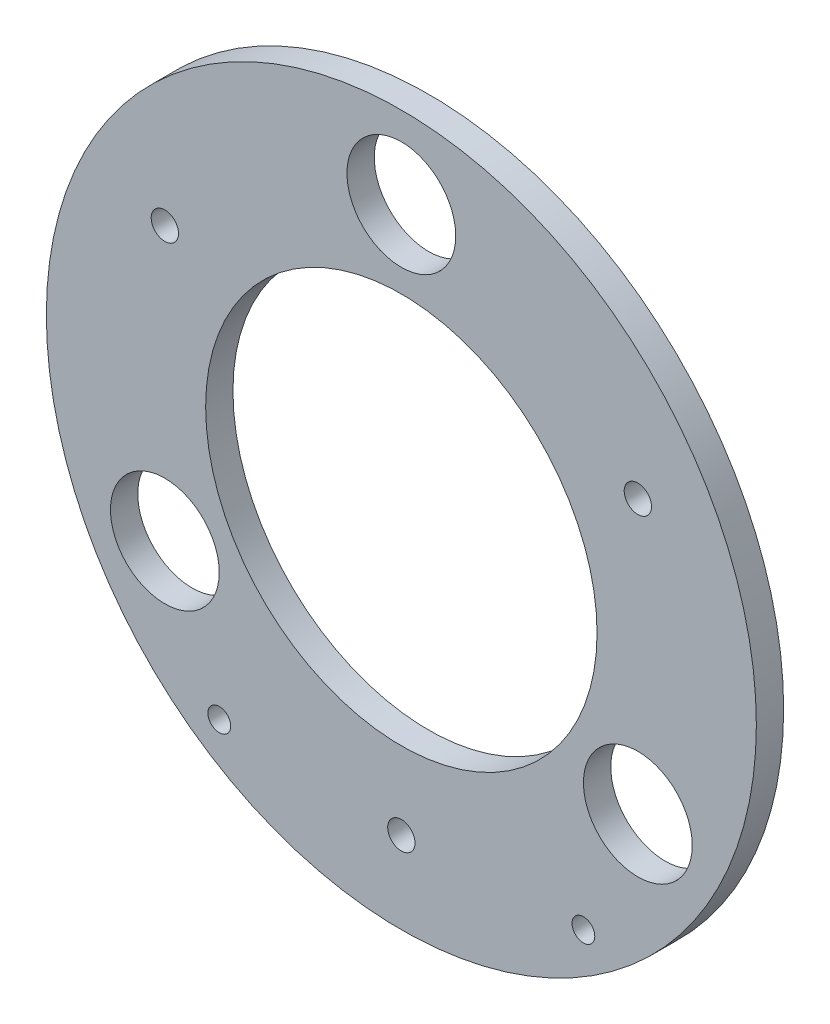
ISO-10303-21;
HEADER;
FILE_DESCRIPTION(('STEP AP214'),'2;1');
FILE_NAME('part.step','',(''),(''),'','','');
FILE_SCHEMA(('AUTOMOTIVE_DESIGN { 1 0 10303 214 1 1 1 1 }'));
ENDSEC;
DATA;
#1=APPLICATION_CONTEXT('core data for automotive mechanical design processes');
#2=APPLICATION_PROTOCOL_DEFINITION('international standard','automotive_design',2000,#1);
#3=PRODUCT_CONTEXT('',#1,'mechanical');
#4=PRODUCT('Part','Part','',(#3));
#5=PRODUCT_RELATED_PRODUCT_CATEGORY('part','',(#4));
#6=PRODUCT_DEFINITION_FORMATION('','',#4);
#7=PRODUCT_DEFINITION_CONTEXT('part definition',#1,'design');
#8=PRODUCT_DEFINITION('design','',#6,#7);
#9=PRODUCT_DEFINITION_SHAPE('','',#8);
#10=(LENGTH_UNIT() NAMED_UNIT(*) SI_UNIT(.MILLI.,.METRE.));
#11=(NAMED_UNIT(*) PLANE_ANGLE_UNIT() SI_UNIT($,.RADIAN.));
#12=(NAMED_UNIT(*) SI_UNIT($,.STERADIAN.) SOLID_ANGLE_UNIT());
#13=UNCERTAINTY_MEASURE_WITH_UNIT(LENGTH_MEASURE(1.E-05),#10,'distance_accuracy_value','');
#14=(GEOMETRIC_REPRESENTATION_CONTEXT(3) GLOBAL_UNCERTAINTY_ASSIGNED_CONTEXT((#13)) GLOBAL_UNIT_ASSIGNED_CONTEXT((#10,
#11,#12)) REPRESENTATION_CONTEXT('',''));
#15=CARTESIAN_POINT('',(0.,0.,0.));
#16=DIRECTION('',(0.,0.,1.));
#17=DIRECTION('',(1.,0.,0.));
#18=AXIS2_PLACEMENT_3D('',#15,#16,#17);
#19=CARTESIAN_POINT('',(0.,0.,3.));
#20=DIRECTION('',(0.,0.,1.));
#21=DIRECTION('',(1.,0.,0.));
#22=AXIS2_PLACEMENT_3D('',#19,#20,#21);
#23=PLANE('',#22);
#24=CARTESIAN_POINT('',(0.,0.,3.));
#25=DIRECTION('',(0.,0.,-1.));
#26=DIRECTION('',(-1.,0.,0.));
#27=AXIS2_PLACEMENT_3D('',#24,#25,#26);
#28=CIRCLE('',#27,21.5);
#29=CARTESIAN_POINT('',(-21.5,0.,3.));
#30=VERTEX_POINT('',#29);
#31=EDGE_CURVE('E73',#30,#30,#28,.T.);
#32=ORIENTED_EDGE('',*,*,#31,.T.);
#33=EDGE_LOOP('',(#32));
#34=FACE_BOUND('',#33,.T.);
#35=CARTESIAN_POINT('',(-20.,-29.,3.));
#36=DIRECTION('',(0.,0.,1.));
#37=DIRECTION('',(1.,0.,0.));
#38=AXIS2_PLACEMENT_3D('',#35,#36,#37);
#39=CIRCLE('',#38,1.25);
#40=CARTESIAN_POINT('',(-18.75,-29.,3.));
#41=VERTEX_POINT('',#40);
#42=EDGE_CURVE('E61',#41,#41,#39,.T.);
#43=ORIENTED_EDGE('',*,*,#42,.F.);
#44=EDGE_LOOP('',(#43));
#45=FACE_BOUND('',#44,.T.);
#46=CARTESIAN_POINT('',(-25.9807621135332,15.,3.));
#47=DIRECTION('',(0.,0.,1.));
#48=DIRECTION('',(1.,0.,0.));
#49=AXIS2_PLACEMENT_3D('',#46,#47,#48);
#50=CIRCLE('',#49,1.5);
#51=CARTESIAN_POINT('',(-24.4807621135332,15.,3.));
#52=VERTEX_POINT('',#51);
#53=EDGE_CURVE('E49',#52,#52,#50,.T.);
#54=ORIENTED_EDGE('',*,*,#53,.F.);
#55=EDGE_LOOP('',(#54));
#56=FACE_BOUND('',#55,.T.);
#57=CARTESIAN_POINT('',(0.,30.,3.));
#58=DIRECTION('',(0.,0.,1.));
#59=DIRECTION('',(1.,0.,0.));
#60=AXIS2_PLACEMENT_3D('',#57,#58,#59);
#61=CIRCLE('',#60,5.975);
#62=CARTESIAN_POINT('',(5.975,30.,3.));
#63=VERTEX_POINT('',#62);
#64=EDGE_CURVE('E37',#63,#63,#61,.T.);
#65=ORIENTED_EDGE('',*,*,#64,.F.);
#66=EDGE_LOOP('',(#65));
#67=FACE_BOUND('',#66,.T.);
#68=CARTESIAN_POINT('',(-25.9807621135332,-15.,3.));
#69=DIRECTION('',(0.,0.,1.));
#70=DIRECTION('',(1.,0.,0.));
#71=AXIS2_PLACEMENT_3D('',#68,#69,#70);
#72=CIRCLE('',#71,5.975);
#73=CARTESIAN_POINT('',(-20.0057621135332,-15.,3.));
#74=VERTEX_POINT('',#73);
#75=EDGE_CURVE('E26',#74,#74,#72,.T.);
#76=ORIENTED_EDGE('',*,*,#75,.F.);
#77=EDGE_LOOP('',(#76));
#78=FACE_BOUND('',#77,.T.);
#79=CARTESIAN_POINT('',(0.,0.,3.));
#80=DIRECTION('',(0.,0.,1.));
#81=DIRECTION('',(1.,0.,0.));
#82=AXIS2_PLACEMENT_3D('',#79,#80,#81);
#83=CIRCLE('',#82,39.);
#84=CARTESIAN_POINT('',(39.,0.,3.));
#85=VERTEX_POINT('',#84);
#86=EDGE_CURVE('E10',#85,#85,#83,.T.);
#87=ORIENTED_EDGE('',*,*,#86,.T.);
#88=EDGE_LOOP('',(#87));
#89=FACE_BOUND('',#88,.T.);
#90=CARTESIAN_POINT('',(25.9807621135332,-15.,3.));
#91=DIRECTION('',(0.,0.,1.));
#92=DIRECTION('',(1.,0.,0.));
#93=AXIS2_PLACEMENT_3D('',#90,#91,#92);
#94=CIRCLE('',#93,5.975);
#95=CARTESIAN_POINT('',(31.9557621135332,-15.,3.));
#96=VERTEX_POINT('',#95);
#97=EDGE_CURVE('E31',#96,#96,#94,.T.);
#98=ORIENTED_EDGE('',*,*,#97,.F.);
#99=EDGE_LOOP('',(#98));
#100=FACE_BOUND('',#99,.T.);
#101=CARTESIAN_POINT('',(25.9807621135332,15.,3.));
#102=DIRECTION('',(0.,0.,1.));
#103=DIRECTION('',(1.,0.,0.));
#104=AXIS2_PLACEMENT_3D('',#101,#102,#103);
#105=CIRCLE('',#104,1.5);
#106=CARTESIAN_POINT('',(27.4807621135332,15.,3.));
#107=VERTEX_POINT('',#106);
#108=EDGE_CURVE('E43',#107,#107,#105,.T.);
#109=ORIENTED_EDGE('',*,*,#108,.F.);
#110=EDGE_LOOP('',(#109));
#111=FACE_BOUND('',#110,.T.);
#112=CARTESIAN_POINT('',(0.,-30.,3.));
#113=DIRECTION('',(0.,0.,1.));
#114=DIRECTION('',(1.,0.,0.));
#115=AXIS2_PLACEMENT_3D('',#112,#113,#114);
#116=CIRCLE('',#115,1.5);
#117=CARTESIAN_POINT('',(1.5,-30.,3.));
#118=VERTEX_POINT('',#117);
#119=EDGE_CURVE('E55',#118,#118,#116,.T.);
#120=ORIENTED_EDGE('',*,*,#119,.F.);
#121=EDGE_LOOP('',(#120));
#122=FACE_BOUND('',#121,.T.);
#123=CARTESIAN_POINT('',(20.,-29.,3.));
#124=DIRECTION('',(0.,0.,1.));
#125=DIRECTION('',(1.,0.,0.));
#126=AXIS2_PLACEMENT_3D('',#123,#124,#125);
#127=CIRCLE('',#126,1.25);
#128=CARTESIAN_POINT('',(21.25,-29.,3.));
#129=VERTEX_POINT('',#128);
#130=EDGE_CURVE('E67',#129,#129,#127,.T.);
#131=ORIENTED_EDGE('',*,*,#130,.F.);
#132=EDGE_LOOP('',(#131));
#133=FACE_BOUND('',#132,.T.);
#134=ADVANCED_FACE('F15',(#34,#45,#56,#67,#78,#89,#100,#111,#122,#133),#23,.T.);
#135=CARTESIAN_POINT('',(0.,0.,0.));
#136=DIRECTION('',(0.,0.,1.));
#137=DIRECTION('',(1.,0.,0.));
#138=AXIS2_PLACEMENT_3D('',#135,#136,#137);
#139=PLANE('',#138);
#140=CARTESIAN_POINT('',(0.,0.,0.));
#141=DIRECTION('',(0.,0.,-1.));
#142=DIRECTION('',(-1.,0.,0.));
#143=AXIS2_PLACEMENT_3D('',#140,#141,#142);
#144=CIRCLE('',#143,21.5);
#145=CARTESIAN_POINT('',(-21.5,0.,0.));
#146=VERTEX_POINT('',#145);
#147=EDGE_CURVE('E76',#146,#146,#144,.T.);
#148=ORIENTED_EDGE('',*,*,#147,.F.);
#149=EDGE_LOOP('',(#148));
#150=FACE_BOUND('',#149,.T.);
#151=CARTESIAN_POINT('',(0.,0.,0.));
#152=DIRECTION('',(0.,0.,1.));
#153=DIRECTION('',(1.,0.,0.));
#154=AXIS2_PLACEMENT_3D('',#151,#152,#153);
#155=CIRCLE('',#154,39.);
#156=CARTESIAN_POINT('',(39.,0.,0.));
#157=VERTEX_POINT('',#156);
#158=EDGE_CURVE('E19',#157,#157,#155,.T.);
#159=ORIENTED_EDGE('',*,*,#158,.F.);
#160=EDGE_LOOP('',(#159));
#161=FACE_BOUND('',#160,.T.);
#162=CARTESIAN_POINT('',(-25.9807621135332,-15.,0.));
#163=DIRECTION('',(0.,0.,1.));
#164=DIRECTION('',(1.,0.,0.));
#165=AXIS2_PLACEMENT_3D('',#162,#163,#164);
#166=CIRCLE('',#165,5.975);
#167=CARTESIAN_POINT('',(-20.0057621135332,-15.,0.));
#168=VERTEX_POINT('',#167);
#169=EDGE_CURVE('E28',#168,#168,#166,.T.);
#170=ORIENTED_EDGE('',*,*,#169,.T.);
#171=EDGE_LOOP('',(#170));
#172=FACE_BOUND('',#171,.T.);
#173=CARTESIAN_POINT('',(25.9807621135332,-15.,0.));
#174=DIRECTION('',(0.,0.,1.));
#175=DIRECTION('',(1.,0.,0.));
#176=AXIS2_PLACEMENT_3D('',#173,#174,#175);
#177=CIRCLE('',#176,5.975);
#178=CARTESIAN_POINT('',(31.9557621135332,-15.,0.));
#179=VERTEX_POINT('',#178);
#180=EDGE_CURVE('E34',#179,#179,#177,.T.);
#181=ORIENTED_EDGE('',*,*,#180,.T.);
#182=EDGE_LOOP('',(#181));
#183=FACE_BOUND('',#182,.T.);
#184=CARTESIAN_POINT('',(0.,30.,0.));
#185=DIRECTION('',(0.,0.,1.));
#186=DIRECTION('',(1.,0.,0.));
#187=AXIS2_PLACEMENT_3D('',#184,#185,#186);
#188=CIRCLE('',#187,5.975);
#189=CARTESIAN_POINT('',(5.975,30.,0.));
#190=VERTEX_POINT('',#189);
#191=EDGE_CURVE('E40',#190,#190,#188,.T.);
#192=ORIENTED_EDGE('',*,*,#191,.T.);
#193=EDGE_LOOP('',(#192));
#194=FACE_BOUND('',#193,.T.);
#195=CARTESIAN_POINT('',(25.9807621135332,15.,0.));
#196=DIRECTION('',(0.,0.,1.));
#197=DIRECTION('',(1.,0.,0.));
#198=AXIS2_PLACEMENT_3D('',#195,#196,#197);
#199=CIRCLE('',#198,1.5);
#200=CARTESIAN_POINT('',(27.4807621135332,15.,0.));
#201=VERTEX_POINT('',#200);
#202=EDGE_CURVE('E46',#201,#201,#199,.T.);
#203=ORIENTED_EDGE('',*,*,#202,.T.);
#204=EDGE_LOOP('',(#203));
#205=FACE_BOUND('',#204,.T.);
#206=CARTESIAN_POINT('',(-25.9807621135332,15.,0.));
#207=DIRECTION('',(0.,0.,1.));
#208=DIRECTION('',(1.,0.,0.));
#209=AXIS2_PLACEMENT_3D('',#206,#207,#208);
#210=CIRCLE('',#209,1.5);
#211=CARTESIAN_POINT('',(-24.4807621135332,15.,0.));
#212=VERTEX_POINT('',#211);
#213=EDGE_CURVE('E52',#212,#212,#210,.T.);
#214=ORIENTED_EDGE('',*,*,#213,.T.);
#215=EDGE_LOOP('',(#214));
#216=FACE_BOUND('',#215,.T.);
#217=CARTESIAN_POINT('',(0.,-30.,0.));
#218=DIRECTION('',(0.,0.,1.));
#219=DIRECTION('',(1.,0.,0.));
#220=AXIS2_PLACEMENT_3D('',#217,#218,#219);
#221=CIRCLE('',#220,1.5);
#222=CARTESIAN_POINT('',(1.5,-30.,0.));
#223=VERTEX_POINT('',#222);
#224=EDGE_CURVE('E58',#223,#223,#221,.T.);
#225=ORIENTED_EDGE('',*,*,#224,.T.);
#226=EDGE_LOOP('',(#225));
#227=FACE_BOUND('',#226,.T.);
#228=CARTESIAN_POINT('',(-20.,-29.,0.));
#229=DIRECTION('',(0.,0.,1.));
#230=DIRECTION('',(1.,0.,0.));
#231=AXIS2_PLACEMENT_3D('',#228,#229,#230);
#232=CIRCLE('',#231,1.25);
#233=CARTESIAN_POINT('',(-18.75,-29.,0.));
#234=VERTEX_POINT('',#233);
#235=EDGE_CURVE('E64',#234,#234,#232,.T.);
#236=ORIENTED_EDGE('',*,*,#235,.T.);
#237=EDGE_LOOP('',(#236));
#238=FACE_BOUND('',#237,.T.);
#239=CARTESIAN_POINT('',(20.,-29.,0.));
#240=DIRECTION('',(0.,0.,1.));
#241=DIRECTION('',(1.,0.,0.));
#242=AXIS2_PLACEMENT_3D('',#239,#240,#241);
#243=CIRCLE('',#242,1.25);
#244=CARTESIAN_POINT('',(21.25,-29.,0.));
#245=VERTEX_POINT('',#244);
#246=EDGE_CURVE('E70',#245,#245,#243,.T.);
#247=ORIENTED_EDGE('',*,*,#246,.T.);
#248=EDGE_LOOP('',(#247));
#249=FACE_BOUND('',#248,.T.);
#250=ADVANCED_FACE('F91',(#150,#161,#172,#183,#194,#205,#216,#227,#238,#249),#139,.F.);
#251=CARTESIAN_POINT('',(0.,0.,3.));
#252=DIRECTION('',(0.,0.,-1.));
#253=DIRECTION('',(-1.,0.,0.));
#254=AXIS2_PLACEMENT_3D('',#251,#252,#253);
#255=CYLINDRICAL_SURFACE('',#254,39.);
#256=ORIENTED_EDGE('',*,*,#86,.F.);
#257=EDGE_LOOP('',(#256));
#258=FACE_BOUND('',#257,.T.);
#259=ORIENTED_EDGE('',*,*,#158,.T.);
#260=EDGE_LOOP('',(#259));
#261=FACE_BOUND('',#260,.T.);
#262=ADVANCED_FACE('F17',(#258,#261),#255,.T.);
#263=CARTESIAN_POINT('',(-25.9807621135332,-15.,3.));
#264=DIRECTION('',(0.,0.,-1.));
#265=DIRECTION('',(-1.,0.,0.));
#266=AXIS2_PLACEMENT_3D('',#263,#264,#265);
#267=CYLINDRICAL_SURFACE('',#266,5.975);
#268=ORIENTED_EDGE('',*,*,#75,.T.);
#269=EDGE_LOOP('',(#268));
#270=FACE_BOUND('',#269,.T.);
#271=ORIENTED_EDGE('',*,*,#169,.F.);
#272=EDGE_LOOP('',(#271));
#273=FACE_BOUND('',#272,.T.);
#274=ADVANCED_FACE('F130',(#270,#273),#267,.F.);
#275=CARTESIAN_POINT('',(25.9807621135332,-15.,3.));
#276=DIRECTION('',(0.,0.,-1.));
#277=DIRECTION('',(-1.,0.,0.));
#278=AXIS2_PLACEMENT_3D('',#275,#276,#277);
#279=CYLINDRICAL_SURFACE('',#278,5.975);
#280=ORIENTED_EDGE('',*,*,#97,.T.);
#281=EDGE_LOOP('',(#280));
#282=FACE_BOUND('',#281,.T.);
#283=ORIENTED_EDGE('',*,*,#180,.F.);
#284=EDGE_LOOP('',(#283));
#285=FACE_BOUND('',#284,.T.);
#286=ADVANCED_FACE('F133',(#282,#285),#279,.F.);
#287=CARTESIAN_POINT('',(0.,30.,3.));
#288=DIRECTION('',(0.,0.,-1.));
#289=DIRECTION('',(-1.,0.,0.));
#290=AXIS2_PLACEMENT_3D('',#287,#288,#289);
#291=CYLINDRICAL_SURFACE('',#290,5.975);
#292=ORIENTED_EDGE('',*,*,#64,.T.);
#293=EDGE_LOOP('',(#292));
#294=FACE_BOUND('',#293,.T.);
#295=ORIENTED_EDGE('',*,*,#191,.F.);
#296=EDGE_LOOP('',(#295));
#297=FACE_BOUND('',#296,.T.);
#298=ADVANCED_FACE('F137',(#294,#297),#291,.F.);
#299=CARTESIAN_POINT('',(25.9807621135332,15.,3.));
#300=DIRECTION('',(0.,0.,-1.));
#301=DIRECTION('',(-1.,0.,0.));
#302=AXIS2_PLACEMENT_3D('',#299,#300,#301);
#303=CYLINDRICAL_SURFACE('',#302,1.5);
#304=ORIENTED_EDGE('',*,*,#108,.T.);
#305=EDGE_LOOP('',(#304));
#306=FACE_BOUND('',#305,.T.);
#307=ORIENTED_EDGE('',*,*,#202,.F.);
#308=EDGE_LOOP('',(#307));
#309=FACE_BOUND('',#308,.T.);
#310=ADVANCED_FACE('F141',(#306,#309),#303,.F.);
#311=CARTESIAN_POINT('',(-25.9807621135332,15.,3.));
#312=DIRECTION('',(0.,0.,-1.));
#313=DIRECTION('',(-1.,0.,0.));
#314=AXIS2_PLACEMENT_3D('',#311,#312,#313);
#315=CYLINDRICAL_SURFACE('',#314,1.5);
#316=ORIENTED_EDGE('',*,*,#53,.T.);
#317=EDGE_LOOP('',(#316));
#318=FACE_BOUND('',#317,.T.);
#319=ORIENTED_EDGE('',*,*,#213,.F.);
#320=EDGE_LOOP('',(#319));
#321=FACE_BOUND('',#320,.T.);
#322=ADVANCED_FACE('F145',(#318,#321),#315,.F.);
#323=CARTESIAN_POINT('',(0.,-30.,3.));
#324=DIRECTION('',(0.,0.,-1.));
#325=DIRECTION('',(-1.,0.,0.));
#326=AXIS2_PLACEMENT_3D('',#323,#324,#325);
#327=CYLINDRICAL_SURFACE('',#326,1.5);
#328=ORIENTED_EDGE('',*,*,#119,.T.);
#329=EDGE_LOOP('',(#328));
#330=FACE_BOUND('',#329,.T.);
#331=ORIENTED_EDGE('',*,*,#224,.F.);
#332=EDGE_LOOP('',(#331));
#333=FACE_BOUND('',#332,.T.);
#334=ADVANCED_FACE('F121',(#330,#333),#327,.F.);
#335=CARTESIAN_POINT('',(-20.,-29.,3.));
#336=DIRECTION('',(0.,0.,-1.));
#337=DIRECTION('',(-1.,0.,0.));
#338=AXIS2_PLACEMENT_3D('',#335,#336,#337);
#339=CYLINDRICAL_SURFACE('',#338,1.25);
#340=ORIENTED_EDGE('',*,*,#42,.T.);
#341=EDGE_LOOP('',(#340));
#342=FACE_BOUND('',#341,.T.);
#343=ORIENTED_EDGE('',*,*,#235,.F.);
#344=EDGE_LOOP('',(#343));
#345=FACE_BOUND('',#344,.T.);
#346=ADVANCED_FACE('F113',(#342,#345),#339,.F.);
#347=CARTESIAN_POINT('',(20.,-29.,3.));
#348=DIRECTION('',(0.,0.,-1.));
#349=DIRECTION('',(-1.,0.,0.));
#350=AXIS2_PLACEMENT_3D('',#347,#348,#349);
#351=CYLINDRICAL_SURFACE('',#350,1.25);
#352=ORIENTED_EDGE('',*,*,#130,.T.);
#353=EDGE_LOOP('',(#352));
#354=FACE_BOUND('',#353,.T.);
#355=ORIENTED_EDGE('',*,*,#246,.F.);
#356=EDGE_LOOP('',(#355));
#357=FACE_BOUND('',#356,.T.);
#358=ADVANCED_FACE('F87',(#354,#357),#351,.F.);
#359=CARTESIAN_POINT('',(0.,0.,3.));
#360=DIRECTION('',(0.,0.,-1.));
#361=DIRECTION('',(-1.,0.,0.));
#362=AXIS2_PLACEMENT_3D('',#359,#360,#361);
#363=CYLINDRICAL_SURFACE('',#362,21.5);
#364=ORIENTED_EDGE('',*,*,#31,.F.);
#365=EDGE_LOOP('',(#364));
#366=FACE_BOUND('',#365,.T.);
#367=ORIENTED_EDGE('',*,*,#147,.T.);
#368=EDGE_LOOP('',(#367));
#369=FACE_BOUND('',#368,.T.);
#370=ADVANCED_FACE('F84',(#366,#369),#363,.F.);
#371=CLOSED_SHELL('',(#134,#250,#262,#274,#286,#298,#310,#322,#334,#346,#358,#370));
#372=MANIFOLD_SOLID_BREP('B1',#371);
#373=ADVANCED_BREP_SHAPE_REPRESENTATION('',(#18,#372),#14);
#374=SHAPE_DEFINITION_REPRESENTATION(#9,#373);
ENDSEC;
END-ISO-10303-21;
